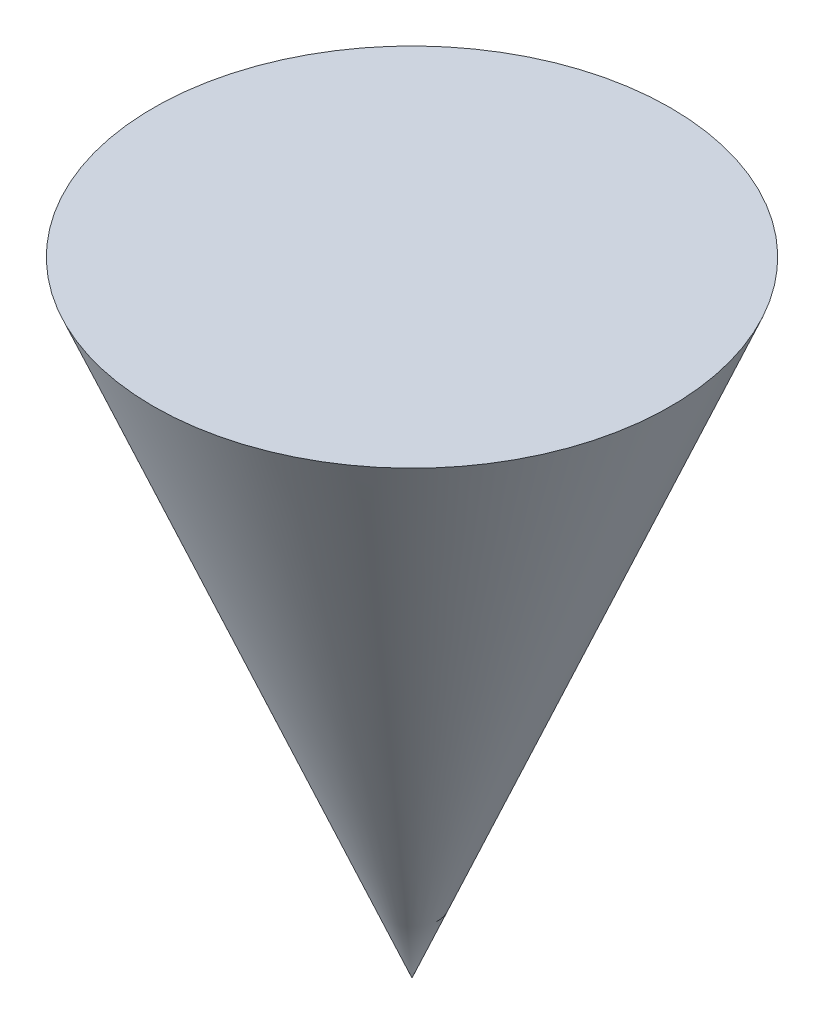
ISO-10303-21;
HEADER;
FILE_DESCRIPTION(('STEP AP214'),'2;1');
FILE_NAME('part.step','',(''),(''),'','','');
FILE_SCHEMA(('AUTOMOTIVE_DESIGN { 1 0 10303 214 1 1 1 1 }'));
ENDSEC;
DATA;
#1=APPLICATION_CONTEXT('core data for automotive mechanical design processes');
#2=APPLICATION_PROTOCOL_DEFINITION('international standard','automotive_design',2000,#1);
#3=PRODUCT_CONTEXT('',#1,'mechanical');
#4=PRODUCT('Part','Part','',(#3));
#5=PRODUCT_RELATED_PRODUCT_CATEGORY('part','',(#4));
#6=PRODUCT_DEFINITION_FORMATION('','',#4);
#7=PRODUCT_DEFINITION_CONTEXT('part definition',#1,'design');
#8=PRODUCT_DEFINITION('design','',#6,#7);
#9=PRODUCT_DEFINITION_SHAPE('','',#8);
#10=(LENGTH_UNIT() NAMED_UNIT(*) SI_UNIT(.MILLI.,.METRE.));
#11=(NAMED_UNIT(*) PLANE_ANGLE_UNIT() SI_UNIT($,.RADIAN.));
#12=(NAMED_UNIT(*) SI_UNIT($,.STERADIAN.) SOLID_ANGLE_UNIT());
#13=UNCERTAINTY_MEASURE_WITH_UNIT(LENGTH_MEASURE(1.E-05),#10,'distance_accuracy_value','');
#14=(GEOMETRIC_REPRESENTATION_CONTEXT(3) GLOBAL_UNCERTAINTY_ASSIGNED_CONTEXT((#13)) GLOBAL_UNIT_ASSIGNED_CONTEXT((#10,
#11,#12)) REPRESENTATION_CONTEXT('',''));
#15=CARTESIAN_POINT('',(0.,0.,0.));
#16=DIRECTION('',(0.,0.,1.));
#17=DIRECTION('',(1.,0.,0.));
#18=AXIS2_PLACEMENT_3D('',#15,#16,#17);
#19=CARTESIAN_POINT('',(8.28427124746192,20.,0.));
#20=DIRECTION('',(0.,1.,0.));
#21=DIRECTION('',(0.,0.,1.));
#22=AXIS2_PLACEMENT_3D('',#19,#20,#21);
#23=PLANE('',#22);
#24=CARTESIAN_POINT('',(0.,20.,0.));
#25=DIRECTION('',(0.,-1.,0.));
#26=DIRECTION('',(0.,0.,-1.));
#27=AXIS2_PLACEMENT_3D('',#24,#25,#26);
#28=CIRCLE('',#27,8.28427124746192);
#29=CARTESIAN_POINT('',(0.,20.,-8.28427124746192));
#30=VERTEX_POINT('',#29);
#31=EDGE_CURVE('E11',#30,#30,#28,.T.);
#32=ORIENTED_EDGE('',*,*,#31,.F.);
#33=EDGE_LOOP('',(#32));
#34=FACE_BOUND('',#33,.T.);
#35=ADVANCED_FACE('F33',(#34),#23,.T.);
#36=CARTESIAN_POINT('',(0.,0.,0.));
#37=DIRECTION('',(0.,1.,0.));
#38=DIRECTION('',(0.,0.,1.));
#39=AXIS2_PLACEMENT_3D('',#36,#37,#38);
#40=CONICAL_SURFACE('',#39,0.,0.392699081698725);
#41=ORIENTED_EDGE('',*,*,#31,.T.);
#42=EDGE_LOOP('',(#41));
#43=FACE_BOUND('',#42,.T.);
#44=CARTESIAN_POINT('',(0.,0.,0.));
#45=VERTEX_POINT('',#44);
#46=VERTEX_LOOP('',#45);
#47=FACE_BOUND('',#46,.T.);
#48=ADVANCED_FACE('F40',(#43,#47),#40,.T.);
#49=CLOSED_SHELL('',(#35,#48));
#50=MANIFOLD_SOLID_BREP('B2',#49);
#51=ADVANCED_BREP_SHAPE_REPRESENTATION('',(#18,#50),#14);
#52=SHAPE_DEFINITION_REPRESENTATION(#9,#51);
ENDSEC;
END-ISO-10303-21;
